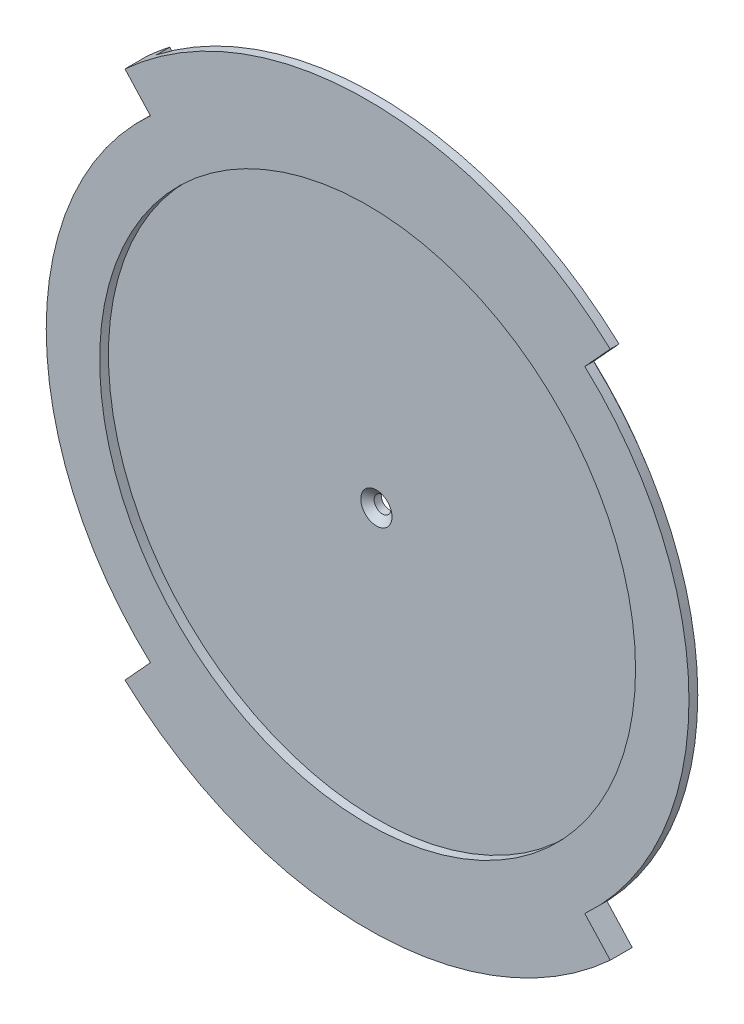
ISO-10303-21;
HEADER;
FILE_DESCRIPTION(('STEP AP214'),'2;1');
FILE_NAME('part.step','',(''),(''),'','','');
FILE_SCHEMA(('AUTOMOTIVE_DESIGN { 1 0 10303 214 1 1 1 1 }'));
ENDSEC;
DATA;
#1=APPLICATION_CONTEXT('core data for automotive mechanical design processes');
#2=APPLICATION_PROTOCOL_DEFINITION('international standard','automotive_design',2000,#1);
#3=PRODUCT_CONTEXT('',#1,'mechanical');
#4=PRODUCT('Part','Part','',(#3));
#5=PRODUCT_RELATED_PRODUCT_CATEGORY('part','',(#4));
#6=PRODUCT_DEFINITION_FORMATION('','',#4);
#7=PRODUCT_DEFINITION_CONTEXT('part definition',#1,'design');
#8=PRODUCT_DEFINITION('design','',#6,#7);
#9=PRODUCT_DEFINITION_SHAPE('','',#8);
#10=(LENGTH_UNIT() NAMED_UNIT(*) SI_UNIT(.MILLI.,.METRE.));
#11=(NAMED_UNIT(*) PLANE_ANGLE_UNIT() SI_UNIT($,.RADIAN.));
#12=(NAMED_UNIT(*) SI_UNIT($,.STERADIAN.) SOLID_ANGLE_UNIT());
#13=UNCERTAINTY_MEASURE_WITH_UNIT(LENGTH_MEASURE(1.E-05),#10,'distance_accuracy_value','');
#14=(GEOMETRIC_REPRESENTATION_CONTEXT(3) GLOBAL_UNCERTAINTY_ASSIGNED_CONTEXT((#13)) GLOBAL_UNIT_ASSIGNED_CONTEXT((#10,
#11,#12)) REPRESENTATION_CONTEXT('',''));
#15=CARTESIAN_POINT('',(0.,0.,0.));
#16=DIRECTION('',(0.,0.,1.));
#17=DIRECTION('',(1.,0.,0.));
#18=AXIS2_PLACEMENT_3D('',#15,#16,#17);
#19=CARTESIAN_POINT('',(0.,0.,0.));
#20=DIRECTION('',(0.,0.,1.));
#21=DIRECTION('',(1.,0.,0.));
#22=AXIS2_PLACEMENT_3D('',#19,#20,#21);
#23=CYLINDRICAL_SURFACE('',#22,81.53);
#24=CARTESIAN_POINT('',(0.,0.,2.00000000000001));
#25=DIRECTION('',(0.,0.,1.));
#26=DIRECTION('',(1.,0.,0.));
#27=AXIS2_PLACEMENT_3D('',#24,#25,#26);
#28=CIRCLE('',#27,81.53);
#29=CARTESIAN_POINT('',(-55.0995856564943,-60.0930658269542,2.00000000000001));
#30=VERTEX_POINT('',#29);
#31=CARTESIAN_POINT('',(55.0995856564943,-60.0930658269542,2.00000000000001));
#32=VERTEX_POINT('',#31);
#33=EDGE_CURVE('E156',#30,#32,#28,.T.);
#34=ORIENTED_EDGE('',*,*,#33,.F.);
#35=DIRECTION('',(0.,0.,1.));
#36=VECTOR('',#35,1.);
#37=CARTESIAN_POINT('',(-55.0995856564943,-60.0930658269542,-7.99999999999999));
#38=LINE('',#37,#36);
#39=CARTESIAN_POINT('',(-55.0995856564943,-60.0930658269542,0.));
#40=VERTEX_POINT('',#39);
#41=EDGE_CURVE('E186',#40,#30,#38,.T.);
#42=ORIENTED_EDGE('',*,*,#41,.F.);
#43=CARTESIAN_POINT('',(0.,0.,0.));
#44=DIRECTION('',(0.,0.,1.));
#45=DIRECTION('',(1.,0.,0.));
#46=AXIS2_PLACEMENT_3D('',#43,#44,#45);
#47=CIRCLE('',#46,81.53);
#48=CARTESIAN_POINT('',(49.9192349997571,-64.4609251953385,0.));
#49=VERTEX_POINT('',#48);
#50=EDGE_CURVE('E56',#40,#49,#47,.T.);
#51=ORIENTED_EDGE('',*,*,#50,.T.);
#52=DIRECTION('',(0.,0.,1.));
#53=VECTOR('',#52,1.);
#54=CARTESIAN_POINT('',(49.9192349997571,-64.4609251953385,-2.99999999999999));
#55=LINE('',#54,#53);
#56=CARTESIAN_POINT('',(49.9192349997571,-64.4609251953385,-2.99999999999999));
#57=VERTEX_POINT('',#56);
#58=EDGE_CURVE('E484',#57,#49,#55,.T.);
#59=ORIENTED_EDGE('',*,*,#58,.F.);
#60=CARTESIAN_POINT('',(0.,0.,-2.99999999999999));
#61=DIRECTION('',(0.,0.,1.));
#62=DIRECTION('',(1.,0.,0.));
#63=AXIS2_PLACEMENT_3D('',#60,#61,#62);
#64=CIRCLE('',#63,81.53);
#65=CARTESIAN_POINT('',(55.0995856564943,-60.0930658269542,-2.99999999999999));
#66=VERTEX_POINT('',#65);
#67=EDGE_CURVE('E195',#57,#66,#64,.T.);
#68=ORIENTED_EDGE('',*,*,#67,.T.);
#69=DIRECTION('',(0.,0.,-1.));
#70=VECTOR('',#69,1.);
#71=CARTESIAN_POINT('',(55.0995856564943,-60.0930658269542,10.));
#72=LINE('',#71,#70);
#73=EDGE_CURVE('E193',#32,#66,#72,.T.);
#74=ORIENTED_EDGE('',*,*,#73,.F.);
#75=EDGE_LOOP('',(#34,#42,#51,#59,#68,#74));
#76=FACE_BOUND('',#75,.T.);
#77=ADVANCED_FACE('F33',(#76),#23,.T.);
#78=CARTESIAN_POINT('',(-68.83,0.,0.));
#79=DIRECTION('',(0.,0.,1.));
#80=DIRECTION('',(1.,0.,0.));
#81=AXIS2_PLACEMENT_3D('',#78,#79,#80);
#82=PLANE('',#81);
#83=ORIENTED_EDGE('',*,*,#50,.F.);
#84=DIRECTION('',(0.675819767649875,0.737066918029611,0.));
#85=VECTOR('',#84,1.);
#86=CARTESIAN_POINT('',(-31.4368882249779,-34.285901989819,0.));
#87=LINE('',#86,#85);
#88=CARTESIAN_POINT('',(-49.3213266430878,-53.791143677801,0.));
#89=VERTEX_POINT('',#88);
#90=EDGE_CURVE('E189',#40,#89,#87,.T.);
#91=ORIENTED_EDGE('',*,*,#90,.T.);
#92=CARTESIAN_POINT('',(0.,0.,0.));
#93=DIRECTION('',(0.,0.,1.));
#94=DIRECTION('',(1.,0.,0.));
#95=AXIS2_PLACEMENT_3D('',#92,#93,#94);
#96=CIRCLE('',#95,72.98);
#97=CARTESIAN_POINT('',(-49.3213266430879,53.791143677801,0.));
#98=VERTEX_POINT('',#97);
#99=EDGE_CURVE('E499',#98,#89,#96,.T.);
#100=ORIENTED_EDGE('',*,*,#99,.F.);
#101=CARTESIAN_POINT('',(0.,0.,0.));
#102=DIRECTION('',(0.,0.,1.));
#103=DIRECTION('',(1.,0.,0.));
#104=AXIS2_PLACEMENT_3D('',#101,#102,#103);
#105=CIRCLE('',#104,72.98);
#106=CARTESIAN_POINT('',(-44.6842361128698,57.7009483718362,0.));
#107=VERTEX_POINT('',#106);
#108=EDGE_CURVE('E467',#98,#107,#105,.F.);
#109=ORIENTED_EDGE('',*,*,#108,.T.);
#110=DIRECTION('',(-0.612280571565769,0.790640564152318,0.));
#111=VECTOR('',#110,1.);
#112=CARTESIAN_POINT('',(-25.8035065091525,33.3201801444274,0.));
#113=LINE('',#112,#111);
#114=CARTESIAN_POINT('',(-49.9192349997571,64.4609251953385,0.));
#115=VERTEX_POINT('',#114);
#116=EDGE_CURVE('E472',#107,#115,#113,.T.);
#117=ORIENTED_EDGE('',*,*,#116,.T.);
#118=CARTESIAN_POINT('',(55.0995856564943,60.0930658269542,0.));
#119=VERTEX_POINT('',#118);
#120=EDGE_CURVE('E173',#119,#115,#47,.T.);
#121=ORIENTED_EDGE('',*,*,#120,.F.);
#122=DIRECTION('',(0.675819767649875,0.737066918029611,0.));
#123=VECTOR('',#122,1.);
#124=CARTESIAN_POINT('',(0.,0.,0.));
#125=LINE('',#124,#123);
#126=CARTESIAN_POINT('',(49.3213266430879,53.7911436778011,0.));
#127=VERTEX_POINT('',#126);
#128=EDGE_CURVE('E209',#127,#119,#125,.T.);
#129=ORIENTED_EDGE('',*,*,#128,.F.);
#130=CARTESIAN_POINT('',(0.,0.,0.));
#131=DIRECTION('',(0.,0.,-1.));
#132=DIRECTION('',(-1.,0.,0.));
#133=AXIS2_PLACEMENT_3D('',#130,#131,#132);
#134=CIRCLE('',#133,72.98);
#135=CARTESIAN_POINT('',(49.3213266430879,-53.7911436778011,0.));
#136=VERTEX_POINT('',#135);
#137=EDGE_CURVE('E501',#127,#136,#134,.T.);
#138=ORIENTED_EDGE('',*,*,#137,.T.);
#139=CARTESIAN_POINT('',(0.,0.,0.));
#140=DIRECTION('',(0.,0.,1.));
#141=DIRECTION('',(1.,0.,0.));
#142=AXIS2_PLACEMENT_3D('',#139,#140,#141);
#143=CIRCLE('',#142,72.98);
#144=CARTESIAN_POINT('',(44.6842361128698,-57.7009483718362,0.));
#145=VERTEX_POINT('',#144);
#146=EDGE_CURVE('E48',#136,#145,#143,.F.);
#147=ORIENTED_EDGE('',*,*,#146,.T.);
#148=DIRECTION('',(0.612280571565769,-0.790640564152318,0.));
#149=VECTOR('',#148,1.);
#150=CARTESIAN_POINT('',(-25.8035065091525,33.3201801444274,0.));
#151=LINE('',#150,#149);
#152=EDGE_CURVE('E493',#145,#49,#151,.T.);
#153=ORIENTED_EDGE('',*,*,#152,.T.);
#154=EDGE_LOOP('',(#83,#91,#100,#109,#117,#121,#129,#138,#147,#153));
#155=FACE_BOUND('',#154,.T.);
#156=CARTESIAN_POINT('',(0.,0.,0.));
#157=DIRECTION('',(0.,0.,1.));
#158=DIRECTION('',(1.,0.,0.));
#159=AXIS2_PLACEMENT_3D('',#156,#157,#158);
#160=CIRCLE('',#159,68.83);
#161=CARTESIAN_POINT('',(68.83,0.,0.));
#162=VERTEX_POINT('',#161);
#163=EDGE_CURVE('E170',#162,#162,#160,.T.);
#164=ORIENTED_EDGE('',*,*,#163,.T.);
#165=EDGE_LOOP('',(#164));
#166=FACE_BOUND('',#165,.T.);
#167=ADVANCED_FACE('F238',(#155,#166),#82,.F.);
#168=CARTESIAN_POINT('',(-68.83,0.,2.00000000000001));
#169=DIRECTION('',(0.,0.,-1.));
#170=DIRECTION('',(-1.,0.,0.));
#171=AXIS2_PLACEMENT_3D('',#168,#169,#170);
#172=PLANE('',#171);
#173=CARTESIAN_POINT('',(0.,0.,2.00000000000001));
#174=DIRECTION('',(0.,0.,1.));
#175=DIRECTION('',(1.,0.,0.));
#176=AXIS2_PLACEMENT_3D('',#173,#174,#175);
#177=CIRCLE('',#176,60.848940548064);
#178=CARTESIAN_POINT('',(60.848940548064,0.,2.00000000000001));
#179=VERTEX_POINT('',#178);
#180=EDGE_CURVE('E155',#179,#179,#177,.T.);
#181=ORIENTED_EDGE('',*,*,#180,.F.);
#182=EDGE_LOOP('',(#181));
#183=FACE_BOUND('',#182,.T.);
#184=DIRECTION('',(-0.675819767649875,-0.737066918029611,0.));
#185=VECTOR('',#184,1.);
#186=CARTESIAN_POINT('',(-49.3213266430879,-53.791143677801,2.00000000000001));
#187=LINE('',#186,#185);
#188=CARTESIAN_POINT('',(-49.3213266430879,-53.791143677801,2.00000000000001));
#189=VERTEX_POINT('',#188);
#190=EDGE_CURVE('E41',#189,#30,#187,.T.);
#191=ORIENTED_EDGE('',*,*,#190,.T.);
#192=ORIENTED_EDGE('',*,*,#33,.T.);
#193=DIRECTION('',(0.675819767649875,-0.737066918029611,0.));
#194=VECTOR('',#193,1.);
#195=CARTESIAN_POINT('',(-31.4368882249779,34.285901989819,2.00000000000001));
#196=LINE('',#195,#194);
#197=CARTESIAN_POINT('',(49.3213266430879,-53.7911436778011,2.00000000000001));
#198=VERTEX_POINT('',#197);
#199=EDGE_CURVE('E139',#198,#32,#196,.T.);
#200=ORIENTED_EDGE('',*,*,#199,.F.);
#201=CARTESIAN_POINT('',(0.,0.,2.00000000000001));
#202=DIRECTION('',(0.,0.,-1.));
#203=DIRECTION('',(-1.,0.,0.));
#204=AXIS2_PLACEMENT_3D('',#201,#202,#203);
#205=CIRCLE('',#204,72.98);
#206=CARTESIAN_POINT('',(49.3213266430879,53.7911436778011,2.00000000000001));
#207=VERTEX_POINT('',#206);
#208=EDGE_CURVE('E177',#207,#198,#205,.T.);
#209=ORIENTED_EDGE('',*,*,#208,.F.);
#210=DIRECTION('',(0.675819767649875,0.737066918029611,0.));
#211=VECTOR('',#210,1.);
#212=CARTESIAN_POINT('',(-31.4368882249779,-34.285901989819,2.00000000000001));
#213=LINE('',#212,#211);
#214=CARTESIAN_POINT('',(55.0995856564943,60.0930658269542,2.00000000000001));
#215=VERTEX_POINT('',#214);
#216=EDGE_CURVE('E154',#207,#215,#213,.T.);
#217=ORIENTED_EDGE('',*,*,#216,.T.);
#218=CARTESIAN_POINT('',(-55.0995856564943,60.0930658269542,2.00000000000001));
#219=VERTEX_POINT('',#218);
#220=EDGE_CURVE('E145',#215,#219,#28,.T.);
#221=ORIENTED_EDGE('',*,*,#220,.T.);
#222=DIRECTION('',(0.675819767649875,-0.737066918029611,0.));
#223=VECTOR('',#222,1.);
#224=CARTESIAN_POINT('',(0.,0.,2.00000000000001));
#225=LINE('',#224,#223);
#226=CARTESIAN_POINT('',(-49.3213266430879,53.791143677801,2.00000000000001));
#227=VERTEX_POINT('',#226);
#228=EDGE_CURVE('E129',#227,#219,#225,.F.);
#229=ORIENTED_EDGE('',*,*,#228,.F.);
#230=CARTESIAN_POINT('',(0.,0.,2.00000000000001));
#231=DIRECTION('',(0.,0.,1.));
#232=DIRECTION('',(1.,0.,0.));
#233=AXIS2_PLACEMENT_3D('',#230,#231,#232);
#234=CIRCLE('',#233,72.98);
#235=EDGE_CURVE('E11',#189,#227,#234,.F.);
#236=ORIENTED_EDGE('',*,*,#235,.F.);
#237=EDGE_LOOP('',(#191,#192,#200,#209,#217,#221,#229,#236));
#238=FACE_BOUND('',#237,.T.);
#239=ADVANCED_FACE('F152',(#183,#238),#172,.F.);
#240=DIRECTION('',(0.,0.,1.));
#241=VECTOR('',#240,1.);
#242=CARTESIAN_POINT('',(-55.0995856564943,60.0930658269542,-2.99999999999999));
#243=LINE('',#242,#241);
#244=CARTESIAN_POINT('',(-55.0995856564943,60.0930658269542,-2.99999999999999));
#245=VERTEX_POINT('',#244);
#246=EDGE_CURVE('E132',#245,#219,#243,.T.);
#247=ORIENTED_EDGE('',*,*,#246,.T.);
#248=ORIENTED_EDGE('',*,*,#220,.F.);
#249=DIRECTION('',(0.,0.,-1.));
#250=VECTOR('',#249,1.);
#251=CARTESIAN_POINT('',(55.0995856564943,60.0930658269542,10.));
#252=LINE('',#251,#250);
#253=EDGE_CURVE('E200',#215,#119,#252,.T.);
#254=ORIENTED_EDGE('',*,*,#253,.T.);
#255=ORIENTED_EDGE('',*,*,#120,.T.);
#256=DIRECTION('',(0.,0.,1.));
#257=VECTOR('',#256,1.);
#258=CARTESIAN_POINT('',(-49.9192349997571,64.4609251953385,-2.99999999999999));
#259=LINE('',#258,#257);
#260=CARTESIAN_POINT('',(-49.9192349997571,64.4609251953385,-2.99999999999999));
#261=VERTEX_POINT('',#260);
#262=EDGE_CURVE('E456',#261,#115,#259,.T.);
#263=ORIENTED_EDGE('',*,*,#262,.F.);
#264=CARTESIAN_POINT('',(0.,0.,-2.99999999999999));
#265=DIRECTION('',(0.,0.,1.));
#266=DIRECTION('',(1.,0.,0.));
#267=AXIS2_PLACEMENT_3D('',#264,#265,#266);
#268=CIRCLE('',#267,81.53);
#269=EDGE_CURVE('E147',#261,#245,#268,.T.);
#270=ORIENTED_EDGE('',*,*,#269,.T.);
#271=EDGE_LOOP('',(#247,#248,#254,#255,#263,#270));
#272=FACE_BOUND('',#271,.T.);
#273=ADVANCED_FACE('F35',(#272),#23,.T.);
#274=CARTESIAN_POINT('',(0.,0.,0.));
#275=DIRECTION('',(0.,0.,1.));
#276=DIRECTION('',(1.,0.,0.));
#277=AXIS2_PLACEMENT_3D('',#274,#275,#276);
#278=CYLINDRICAL_SURFACE('',#277,68.83);
#279=ORIENTED_EDGE('',*,*,#163,.F.);
#280=EDGE_LOOP('',(#279));
#281=FACE_BOUND('',#280,.T.);
#282=CARTESIAN_POINT('',(0.,0.,-2.99999999999999));
#283=DIRECTION('',(0.,0.,1.));
#284=DIRECTION('',(1.,0.,0.));
#285=AXIS2_PLACEMENT_3D('',#282,#283,#284);
#286=CIRCLE('',#285,68.83);
#287=CARTESIAN_POINT('',(68.83,0.,-2.99999999999999));
#288=VERTEX_POINT('',#287);
#289=EDGE_CURVE('E167',#288,#288,#286,.T.);
#290=ORIENTED_EDGE('',*,*,#289,.T.);
#291=EDGE_LOOP('',(#290));
#292=FACE_BOUND('',#291,.T.);
#293=ADVANCED_FACE('F243',(#281,#292),#278,.T.);
#294=CARTESIAN_POINT('',(0.,0.,-3.));
#295=DIRECTION('',(0.,0.,1.));
#296=DIRECTION('',(1.,0.,0.));
#297=AXIS2_PLACEMENT_3D('',#294,#295,#296);
#298=PLANE('',#297);
#299=CARTESIAN_POINT('',(0.,0.307599268816759,-2.99999999999999));
#300=DIRECTION('',(0.,0.,1.));
#301=DIRECTION('',(1.,0.,0.));
#302=AXIS2_PLACEMENT_3D('',#299,#300,#301);
#303=CIRCLE('',#302,1.89865);
#304=CARTESIAN_POINT('',(1.89865,0.307599268816759,-2.99999999999999));
#305=VERTEX_POINT('',#304);
#306=EDGE_CURVE('E161',#305,#305,#303,.T.);
#307=ORIENTED_EDGE('',*,*,#306,.T.);
#308=EDGE_LOOP('',(#307));
#309=FACE_BOUND('',#308,.T.);
#310=ORIENTED_EDGE('',*,*,#289,.F.);
#311=EDGE_LOOP('',(#310));
#312=FACE_BOUND('',#311,.T.);
#313=ADVANCED_FACE('F218',(#309,#312),#298,.F.);
#314=CARTESIAN_POINT('',(0.,0.,0.));
#315=DIRECTION('',(0.,0.,-1.));
#316=DIRECTION('',(-1.,0.,0.));
#317=AXIS2_PLACEMENT_3D('',#314,#315,#316);
#318=PLANE('',#317);
#319=CARTESIAN_POINT('',(0.,0.307599268816759,0.));
#320=DIRECTION('',(0.,0.,1.));
#321=DIRECTION('',(1.,0.,0.));
#322=AXIS2_PLACEMENT_3D('',#319,#320,#321);
#323=CIRCLE('',#322,3.5433);
#324=CARTESIAN_POINT('',(3.5433,0.307599268816759,0.));
#325=VERTEX_POINT('',#324);
#326=EDGE_CURVE('E202',#325,#325,#323,.T.);
#327=ORIENTED_EDGE('',*,*,#326,.F.);
#328=EDGE_LOOP('',(#327));
#329=FACE_BOUND('',#328,.T.);
#330=CARTESIAN_POINT('',(0.,0.,0.));
#331=DIRECTION('',(0.,0.,1.));
#332=DIRECTION('',(1.,0.,0.));
#333=AXIS2_PLACEMENT_3D('',#330,#331,#332);
#334=CIRCLE('',#333,60.848940548064);
#335=CARTESIAN_POINT('',(60.848940548064,0.,0.));
#336=VERTEX_POINT('',#335);
#337=EDGE_CURVE('E159',#336,#336,#334,.T.);
#338=ORIENTED_EDGE('',*,*,#337,.T.);
#339=EDGE_LOOP('',(#338));
#340=FACE_BOUND('',#339,.T.);
#341=ADVANCED_FACE('F233',(#329,#340),#318,.F.);
#342=CARTESIAN_POINT('',(0.,0.,0.));
#343=DIRECTION('',(0.,0.,1.));
#344=DIRECTION('',(1.,0.,0.));
#345=AXIS2_PLACEMENT_3D('',#342,#343,#344);
#346=CYLINDRICAL_SURFACE('',#345,60.848940548064);
#347=ORIENTED_EDGE('',*,*,#337,.F.);
#348=EDGE_LOOP('',(#347));
#349=FACE_BOUND('',#348,.T.);
#350=ORIENTED_EDGE('',*,*,#180,.T.);
#351=EDGE_LOOP('',(#350));
#352=FACE_BOUND('',#351,.T.);
#353=ADVANCED_FACE('F224',(#349,#352),#346,.F.);
#354=CARTESIAN_POINT('',(0.,0.307599268816759,0.));
#355=DIRECTION('',(0.,0.,1.));
#356=DIRECTION('',(1.,0.,0.));
#357=AXIS2_PLACEMENT_3D('',#354,#355,#356);
#358=CYLINDRICAL_SURFACE('',#357,1.89865);
#359=ORIENTED_EDGE('',*,*,#306,.F.);
#360=EDGE_LOOP('',(#359));
#361=FACE_BOUND('',#360,.T.);
#362=CARTESIAN_POINT('',(0.,0.307599268816759,-1.38002520841571));
#363=DIRECTION('',(0.,0.,1.));
#364=DIRECTION('',(1.,0.,0.));
#365=AXIS2_PLACEMENT_3D('',#362,#363,#364);
#366=CIRCLE('',#365,1.89865);
#367=CARTESIAN_POINT('',(1.89865,0.307599268816759,-1.38002520841571));
#368=VERTEX_POINT('',#367);
#369=EDGE_CURVE('E211',#368,#368,#366,.T.);
#370=ORIENTED_EDGE('',*,*,#369,.T.);
#371=EDGE_LOOP('',(#370));
#372=FACE_BOUND('',#371,.T.);
#373=ADVANCED_FACE('F221',(#361,#372),#358,.F.);
#374=CARTESIAN_POINT('',(0.,0.307599268816759,0.));
#375=DIRECTION('',(0.,0.,1.));
#376=DIRECTION('',(1.,0.,0.));
#377=AXIS2_PLACEMENT_3D('',#374,#375,#376);
#378=CONICAL_SURFACE('',#377,3.5433,0.872664625997164);
#379=ORIENTED_EDGE('',*,*,#369,.F.);
#380=EDGE_LOOP('',(#379));
#381=FACE_BOUND('',#380,.T.);
#382=ORIENTED_EDGE('',*,*,#326,.T.);
#383=EDGE_LOOP('',(#382));
#384=FACE_BOUND('',#383,.T.);
#385=ADVANCED_FACE('F223',(#381,#384),#378,.F.);
#386=CARTESIAN_POINT('',(0.,0.,10.));
#387=DIRECTION('',(0.,0.,-1.));
#388=DIRECTION('',(-1.,0.,0.));
#389=AXIS2_PLACEMENT_3D('',#386,#387,#388);
#390=CYLINDRICAL_SURFACE('',#389,72.98);
#391=ORIENTED_EDGE('',*,*,#208,.T.);
#392=DIRECTION('',(0.,0.,-1.));
#393=VECTOR('',#392,1.);
#394=CARTESIAN_POINT('',(49.3213266430879,-53.7911436778011,10.));
#395=LINE('',#394,#393);
#396=EDGE_CURVE('E199',#198,#136,#395,.T.);
#397=ORIENTED_EDGE('',*,*,#396,.T.);
#398=ORIENTED_EDGE('',*,*,#137,.F.);
#399=DIRECTION('',(0.,0.,-1.));
#400=VECTOR('',#399,1.);
#401=CARTESIAN_POINT('',(49.3213266430879,53.7911436778011,10.));
#402=LINE('',#401,#400);
#403=EDGE_CURVE('E204',#207,#127,#402,.T.);
#404=ORIENTED_EDGE('',*,*,#403,.F.);
#405=EDGE_LOOP('',(#391,#397,#398,#404));
#406=FACE_BOUND('',#405,.T.);
#407=ADVANCED_FACE('F230',(#406),#390,.T.);
#408=CARTESIAN_POINT('',(0.,0.,10.));
#409=DIRECTION('',(0.737066918029611,0.675819767649875,0.));
#410=DIRECTION('',(-0.675819767649875,0.737066918029611,0.));
#411=AXIS2_PLACEMENT_3D('',#408,#409,#410);
#412=PLANE('',#411);
#413=ORIENTED_EDGE('',*,*,#199,.T.);
#414=ORIENTED_EDGE('',*,*,#73,.T.);
#415=DIRECTION('',(-0.675819767649875,0.737066918029611,0.));
#416=VECTOR('',#415,1.);
#417=CARTESIAN_POINT('',(49.3213266430879,-53.7911436778011,-2.99999999999999));
#418=LINE('',#417,#416);
#419=CARTESIAN_POINT('',(49.3213266430879,-53.7911436778011,-2.99999999999999));
#420=VERTEX_POINT('',#419);
#421=EDGE_CURVE('E475',#66,#420,#418,.T.);
#422=ORIENTED_EDGE('',*,*,#421,.T.);
#423=DIRECTION('',(0.,0.,1.));
#424=VECTOR('',#423,1.);
#425=CARTESIAN_POINT('',(49.3213266430879,-53.7911436778011,-2.99999999999999));
#426=LINE('',#425,#424);
#427=EDGE_CURVE('E483',#420,#136,#426,.T.);
#428=ORIENTED_EDGE('',*,*,#427,.T.);
#429=ORIENTED_EDGE('',*,*,#396,.F.);
#430=EDGE_LOOP('',(#413,#414,#422,#428,#429));
#431=FACE_BOUND('',#430,.T.);
#432=ADVANCED_FACE('F307',(#431),#412,.T.);
#433=CARTESIAN_POINT('',(0.,0.,10.));
#434=DIRECTION('',(-0.737066918029611,0.675819767649875,0.));
#435=DIRECTION('',(-0.675819767649875,-0.737066918029611,0.));
#436=AXIS2_PLACEMENT_3D('',#433,#434,#435);
#437=PLANE('',#436);
#438=ORIENTED_EDGE('',*,*,#403,.T.);
#439=ORIENTED_EDGE('',*,*,#128,.T.);
#440=ORIENTED_EDGE('',*,*,#253,.F.);
#441=ORIENTED_EDGE('',*,*,#216,.F.);
#442=EDGE_LOOP('',(#438,#439,#440,#441));
#443=FACE_BOUND('',#442,.T.);
#444=ADVANCED_FACE('F317',(#443),#437,.F.);
#445=CARTESIAN_POINT('',(0.,0.,-2.99999999999999));
#446=DIRECTION('',(0.,0.,1.));
#447=DIRECTION('',(1.,0.,0.));
#448=AXIS2_PLACEMENT_3D('',#445,#446,#447);
#449=CYLINDRICAL_SURFACE('',#448,72.98);
#450=ORIENTED_EDGE('',*,*,#99,.T.);
#451=DIRECTION('',(0.,0.,1.));
#452=VECTOR('',#451,1.);
#453=CARTESIAN_POINT('',(-49.3213266430878,-53.791143677801,-2.99999999999999));
#454=LINE('',#453,#452);
#455=EDGE_CURVE('E495',#89,#189,#454,.T.);
#456=ORIENTED_EDGE('',*,*,#455,.T.);
#457=ORIENTED_EDGE('',*,*,#235,.T.);
#458=DIRECTION('',(0.,0.,1.));
#459=VECTOR('',#458,1.);
#460=CARTESIAN_POINT('',(-49.3213266430879,53.791143677801,-2.99999999999999));
#461=LINE('',#460,#459);
#462=EDGE_CURVE('E135',#98,#227,#461,.T.);
#463=ORIENTED_EDGE('',*,*,#462,.F.);
#464=EDGE_LOOP('',(#450,#456,#457,#463));
#465=FACE_BOUND('',#464,.T.);
#466=ADVANCED_FACE('F326',(#465),#449,.T.);
#467=CARTESIAN_POINT('',(0.,0.,-2.99999999999999));
#468=DIRECTION('',(0.737066918029611,-0.675819767649875,0.));
#469=DIRECTION('',(0.675819767649875,0.737066918029611,0.));
#470=AXIS2_PLACEMENT_3D('',#467,#468,#469);
#471=PLANE('',#470);
#472=ORIENTED_EDGE('',*,*,#90,.F.);
#473=ORIENTED_EDGE('',*,*,#41,.T.);
#474=ORIENTED_EDGE('',*,*,#190,.F.);
#475=ORIENTED_EDGE('',*,*,#455,.F.);
#476=EDGE_LOOP('',(#472,#473,#474,#475));
#477=FACE_BOUND('',#476,.T.);
#478=ADVANCED_FACE('F187',(#477),#471,.F.);
#479=CARTESIAN_POINT('',(0.,0.,-2.99999999999999));
#480=DIRECTION('',(-0.737066918029611,-0.675819767649875,0.));
#481=DIRECTION('',(0.675819767649875,-0.737066918029611,0.));
#482=AXIS2_PLACEMENT_3D('',#479,#480,#481);
#483=PLANE('',#482);
#484=ORIENTED_EDGE('',*,*,#228,.T.);
#485=ORIENTED_EDGE('',*,*,#246,.F.);
#486=DIRECTION('',(0.675819767649874,-0.737066918029611,0.));
#487=VECTOR('',#486,1.);
#488=CARTESIAN_POINT('',(-49.3213266430879,53.791143677801,-2.99999999999999));
#489=LINE('',#488,#487);
#490=CARTESIAN_POINT('',(-49.3213266430879,53.791143677801,-2.99999999999999));
#491=VERTEX_POINT('',#490);
#492=EDGE_CURVE('E454',#245,#491,#489,.T.);
#493=ORIENTED_EDGE('',*,*,#492,.T.);
#494=DIRECTION('',(0.,0.,1.));
#495=VECTOR('',#494,1.);
#496=CARTESIAN_POINT('',(-49.3213266430879,53.791143677801,-2.99999999999999));
#497=LINE('',#496,#495);
#498=EDGE_CURVE('E148',#491,#98,#497,.T.);
#499=ORIENTED_EDGE('',*,*,#498,.T.);
#500=ORIENTED_EDGE('',*,*,#462,.T.);
#501=EDGE_LOOP('',(#484,#485,#493,#499,#500));
#502=FACE_BOUND('',#501,.T.);
#503=ADVANCED_FACE('F131',(#502),#483,.T.);
#504=CARTESIAN_POINT('',(44.6842361128698,-57.7009483718362,-2.99999999999999));
#505=DIRECTION('',(-0.790640564152318,-0.612280571565769,0.));
#506=DIRECTION('',(0.612280571565769,-0.790640564152318,0.));
#507=AXIS2_PLACEMENT_3D('',#504,#505,#506);
#508=PLANE('',#507);
#509=ORIENTED_EDGE('',*,*,#152,.F.);
#510=DIRECTION('',(0.,0.,1.));
#511=VECTOR('',#510,1.);
#512=CARTESIAN_POINT('',(44.6842361128698,-57.7009483718362,-2.99999999999999));
#513=LINE('',#512,#511);
#514=CARTESIAN_POINT('',(44.6842361128698,-57.7009483718362,-2.99999999999999));
#515=VERTEX_POINT('',#514);
#516=EDGE_CURVE('E487',#515,#145,#513,.T.);
#517=ORIENTED_EDGE('',*,*,#516,.F.);
#518=DIRECTION('',(0.612280571565769,-0.790640564152318,0.));
#519=VECTOR('',#518,1.);
#520=CARTESIAN_POINT('',(44.6842361128698,-57.7009483718362,-2.99999999999999));
#521=LINE('',#520,#519);
#522=EDGE_CURVE('E480',#515,#57,#521,.T.);
#523=ORIENTED_EDGE('',*,*,#522,.T.);
#524=ORIENTED_EDGE('',*,*,#58,.T.);
#525=EDGE_LOOP('',(#509,#517,#523,#524));
#526=FACE_BOUND('',#525,.T.);
#527=ADVANCED_FACE('F364',(#526),#508,.T.);
#528=CARTESIAN_POINT('',(0.,0.,-2.99999999999999));
#529=DIRECTION('',(0.,0.,1.));
#530=DIRECTION('',(1.,0.,0.));
#531=AXIS2_PLACEMENT_3D('',#528,#529,#530);
#532=CYLINDRICAL_SURFACE('',#531,72.98);
#533=ORIENTED_EDGE('',*,*,#146,.F.);
#534=ORIENTED_EDGE('',*,*,#427,.F.);
#535=CARTESIAN_POINT('',(0.,0.,-2.99999999999999));
#536=DIRECTION('',(0.,0.,-1.));
#537=DIRECTION('',(1.,0.,0.));
#538=AXIS2_PLACEMENT_3D('',#535,#536,#537);
#539=CIRCLE('',#538,72.98);
#540=EDGE_CURVE('E477',#420,#515,#539,.T.);
#541=ORIENTED_EDGE('',*,*,#540,.T.);
#542=ORIENTED_EDGE('',*,*,#516,.T.);
#543=EDGE_LOOP('',(#533,#534,#541,#542));
#544=FACE_BOUND('',#543,.T.);
#545=ADVANCED_FACE('F376',(#544),#532,.F.);
#546=CARTESIAN_POINT('',(0.,0.,-2.99999999999999));
#547=DIRECTION('',(0.,0.,1.));
#548=DIRECTION('',(1.,0.,0.));
#549=AXIS2_PLACEMENT_3D('',#546,#547,#548);
#550=PLANE('',#549);
#551=ORIENTED_EDGE('',*,*,#67,.F.);
#552=ORIENTED_EDGE('',*,*,#522,.F.);
#553=ORIENTED_EDGE('',*,*,#540,.F.);
#554=ORIENTED_EDGE('',*,*,#421,.F.);
#555=EDGE_LOOP('',(#551,#552,#553,#554));
#556=FACE_BOUND('',#555,.T.);
#557=ADVANCED_FACE('F385',(#556),#550,.F.);
#558=CARTESIAN_POINT('',(-44.6842361128698,57.7009483718362,-2.99999999999999));
#559=DIRECTION('',(0.790640564152318,0.612280571565769,0.));
#560=DIRECTION('',(-0.612280571565769,0.790640564152318,0.));
#561=AXIS2_PLACEMENT_3D('',#558,#559,#560);
#562=PLANE('',#561);
#563=ORIENTED_EDGE('',*,*,#116,.F.);
#564=DIRECTION('',(0.,0.,1.));
#565=VECTOR('',#564,1.);
#566=CARTESIAN_POINT('',(-44.6842361128698,57.7009483718362,-2.99999999999999));
#567=LINE('',#566,#565);
#568=CARTESIAN_POINT('',(-44.6842361128698,57.7009483718362,-2.99999999999999));
#569=VERTEX_POINT('',#568);
#570=EDGE_CURVE('E459',#569,#107,#567,.T.);
#571=ORIENTED_EDGE('',*,*,#570,.F.);
#572=DIRECTION('',(-0.612280571565769,0.790640564152318,0.));
#573=VECTOR('',#572,1.);
#574=CARTESIAN_POINT('',(-44.6842361128698,57.7009483718362,-2.99999999999999));
#575=LINE('',#574,#573);
#576=EDGE_CURVE('E149',#569,#261,#575,.T.);
#577=ORIENTED_EDGE('',*,*,#576,.T.);
#578=ORIENTED_EDGE('',*,*,#262,.T.);
#579=EDGE_LOOP('',(#563,#571,#577,#578));
#580=FACE_BOUND('',#579,.T.);
#581=ADVANCED_FACE('F394',(#580),#562,.T.);
#582=CARTESIAN_POINT('',(0.,0.,-2.99999999999999));
#583=DIRECTION('',(0.,0.,1.));
#584=DIRECTION('',(1.,0.,0.));
#585=AXIS2_PLACEMENT_3D('',#582,#583,#584);
#586=CYLINDRICAL_SURFACE('',#585,72.98);
#587=ORIENTED_EDGE('',*,*,#108,.F.);
#588=ORIENTED_EDGE('',*,*,#498,.F.);
#589=CARTESIAN_POINT('',(0.,0.,-2.99999999999999));
#590=DIRECTION('',(0.,0.,-1.));
#591=DIRECTION('',(1.,0.,0.));
#592=AXIS2_PLACEMENT_3D('',#589,#590,#591);
#593=CIRCLE('',#592,72.98);
#594=EDGE_CURVE('E461',#491,#569,#593,.T.);
#595=ORIENTED_EDGE('',*,*,#594,.T.);
#596=ORIENTED_EDGE('',*,*,#570,.T.);
#597=EDGE_LOOP('',(#587,#588,#595,#596));
#598=FACE_BOUND('',#597,.T.);
#599=ADVANCED_FACE('F403',(#598),#586,.F.);
#600=CARTESIAN_POINT('',(0.,0.,-2.99999999999999));
#601=DIRECTION('',(0.,0.,1.));
#602=DIRECTION('',(1.,0.,0.));
#603=AXIS2_PLACEMENT_3D('',#600,#601,#602);
#604=PLANE('',#603);
#605=ORIENTED_EDGE('',*,*,#269,.F.);
#606=ORIENTED_EDGE('',*,*,#576,.F.);
#607=ORIENTED_EDGE('',*,*,#594,.F.);
#608=ORIENTED_EDGE('',*,*,#492,.F.);
#609=EDGE_LOOP('',(#605,#606,#607,#608));
#610=FACE_BOUND('',#609,.T.);
#611=ADVANCED_FACE('F412',(#610),#604,.F.);
#612=CLOSED_SHELL('',(#77,#167,#239,#273,#293,#313,#341,#353,#373,#385,#407,#432,#444,#466,#478,
#503,#527,#545,#557,#581,#599,#611));
#613=MANIFOLD_SOLID_BREP('B2',#612);
#614=ADVANCED_BREP_SHAPE_REPRESENTATION('',(#18,#613),#14);
#615=SHAPE_DEFINITION_REPRESENTATION(#9,#614);
ENDSEC;
END-ISO-10303-21;
